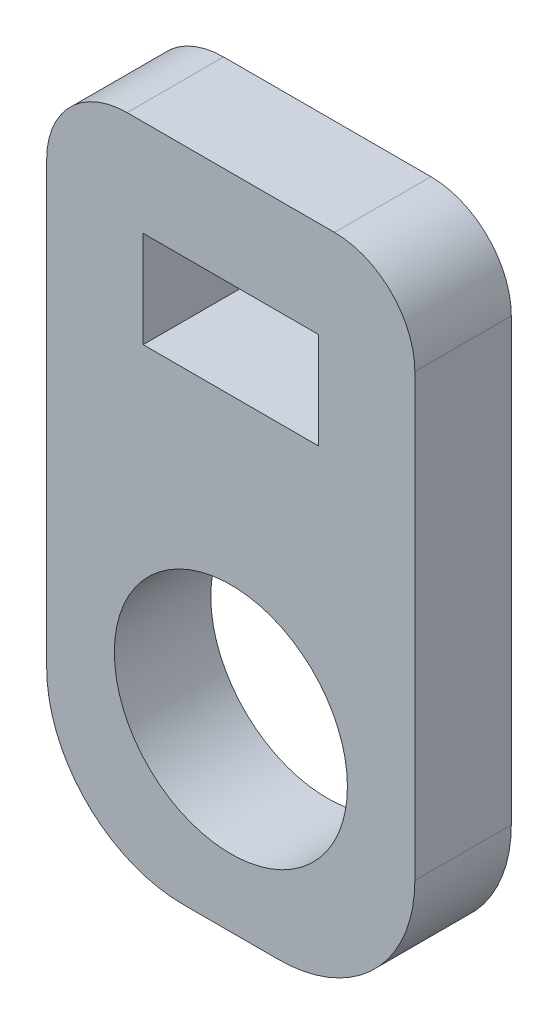
ISO-10303-21;
HEADER;
FILE_DESCRIPTION(('STEP AP214'),'2;1');
FILE_NAME('part.step','',(''),(''),'','','');
FILE_SCHEMA(('AUTOMOTIVE_DESIGN { 1 0 10303 214 1 1 1 1 }'));
ENDSEC;
DATA;
#1=APPLICATION_CONTEXT('core data for automotive mechanical design processes');
#2=APPLICATION_PROTOCOL_DEFINITION('international standard','automotive_design',2000,#1);
#3=PRODUCT_CONTEXT('',#1,'mechanical');
#4=PRODUCT('Part','Part','',(#3));
#5=PRODUCT_RELATED_PRODUCT_CATEGORY('part','',(#4));
#6=PRODUCT_DEFINITION_FORMATION('','',#4);
#7=PRODUCT_DEFINITION_CONTEXT('part definition',#1,'design');
#8=PRODUCT_DEFINITION('design','',#6,#7);
#9=PRODUCT_DEFINITION_SHAPE('','',#8);
#10=(LENGTH_UNIT() NAMED_UNIT(*) SI_UNIT(.MILLI.,.METRE.));
#11=(NAMED_UNIT(*) PLANE_ANGLE_UNIT() SI_UNIT($,.RADIAN.));
#12=(NAMED_UNIT(*) SI_UNIT($,.STERADIAN.) SOLID_ANGLE_UNIT());
#13=UNCERTAINTY_MEASURE_WITH_UNIT(LENGTH_MEASURE(1.E-05),#10,'distance_accuracy_value','');
#14=(GEOMETRIC_REPRESENTATION_CONTEXT(3) GLOBAL_UNCERTAINTY_ASSIGNED_CONTEXT((#13)) GLOBAL_UNIT_ASSIGNED_CONTEXT((#10,
#11,#12)) REPRESENTATION_CONTEXT('',''));
#15=CARTESIAN_POINT('',(0.,0.,0.));
#16=DIRECTION('',(0.,0.,1.));
#17=DIRECTION('',(1.,0.,0.));
#18=AXIS2_PLACEMENT_3D('',#15,#16,#17);
#19=CARTESIAN_POINT('',(0.,0.,15.24));
#20=DIRECTION('',(1.,0.,0.));
#21=DIRECTION('',(0.,0.,-1.));
#22=AXIS2_PLACEMENT_3D('',#19,#20,#21);
#23=PLANE('',#22);
#24=DIRECTION('',(0.,-1.,0.));
#25=VECTOR('',#24,1.);
#26=CARTESIAN_POINT('',(0.,0.,15.24));
#27=LINE('',#26,#25);
#28=CARTESIAN_POINT('',(0.,91.219999932,15.24));
#29=VERTEX_POINT('',#28);
#30=CARTESIAN_POINT('',(0.,21.59,15.24));
#31=VERTEX_POINT('',#30);
#32=EDGE_CURVE('E171',#29,#31,#27,.T.);
#33=ORIENTED_EDGE('',*,*,#32,.F.);
#34=DIRECTION('',(0.,0.,-1.));
#35=VECTOR('',#34,1.);
#36=CARTESIAN_POINT('',(0.,91.219999932,15.24));
#37=LINE('',#36,#35);
#38=CARTESIAN_POINT('',(0.,91.219999932,0.));
#39=VERTEX_POINT('',#38);
#40=EDGE_CURVE('E208',#29,#39,#37,.T.);
#41=ORIENTED_EDGE('',*,*,#40,.T.);
#42=DIRECTION('',(0.,-1.,0.));
#43=VECTOR('',#42,1.);
#44=CARTESIAN_POINT('',(0.,0.,0.));
#45=LINE('',#44,#43);
#46=CARTESIAN_POINT('',(0.,21.59,0.));
#47=VERTEX_POINT('',#46);
#48=EDGE_CURVE('E167',#39,#47,#45,.T.);
#49=ORIENTED_EDGE('',*,*,#48,.T.);
#50=DIRECTION('',(0.,0.,-1.));
#51=VECTOR('',#50,1.);
#52=CARTESIAN_POINT('',(0.,21.59,15.24));
#53=LINE('',#52,#51);
#54=EDGE_CURVE('E205',#47,#31,#53,.F.);
#55=ORIENTED_EDGE('',*,*,#54,.T.);
#56=EDGE_LOOP('',(#33,#41,#49,#55));
#57=FACE_BOUND('',#56,.T.);
#58=ADVANCED_FACE('F33',(#57),#23,.F.);
#59=CARTESIAN_POINT('',(0.,0.,15.24));
#60=DIRECTION('',(0.,1.,0.));
#61=DIRECTION('',(0.,0.,1.));
#62=AXIS2_PLACEMENT_3D('',#59,#60,#61);
#63=PLANE('',#62);
#64=DIRECTION('',(1.,0.,0.));
#65=VECTOR('',#64,1.);
#66=CARTESIAN_POINT('',(0.,0.,0.));
#67=LINE('',#66,#65);
#68=CARTESIAN_POINT('',(21.59,0.,0.));
#69=VERTEX_POINT('',#68);
#70=CARTESIAN_POINT('',(36.576,0.,0.));
#71=VERTEX_POINT('',#70);
#72=EDGE_CURVE('E183',#69,#71,#67,.T.);
#73=ORIENTED_EDGE('',*,*,#72,.T.);
#74=DIRECTION('',(0.,0.,-1.));
#75=VECTOR('',#74,1.);
#76=CARTESIAN_POINT('',(36.576,0.,15.24));
#77=LINE('',#76,#75);
#78=CARTESIAN_POINT('',(36.576,0.,15.24));
#79=VERTEX_POINT('',#78);
#80=EDGE_CURVE('E199',#71,#79,#77,.F.);
#81=ORIENTED_EDGE('',*,*,#80,.T.);
#82=DIRECTION('',(1.,0.,0.));
#83=VECTOR('',#82,1.);
#84=CARTESIAN_POINT('',(0.,0.,15.24));
#85=LINE('',#84,#83);
#86=CARTESIAN_POINT('',(21.59,0.,15.24));
#87=VERTEX_POINT('',#86);
#88=EDGE_CURVE('E173',#87,#79,#85,.T.);
#89=ORIENTED_EDGE('',*,*,#88,.F.);
#90=DIRECTION('',(0.,0.,-1.));
#91=VECTOR('',#90,1.);
#92=CARTESIAN_POINT('',(21.59,0.,15.24));
#93=LINE('',#92,#91);
#94=EDGE_CURVE('E196',#87,#69,#93,.T.);
#95=ORIENTED_EDGE('',*,*,#94,.T.);
#96=EDGE_LOOP('',(#73,#81,#89,#95));
#97=FACE_BOUND('',#96,.T.);
#98=ADVANCED_FACE('F245',(#97),#63,.F.);
#99=CARTESIAN_POINT('',(58.166,0.,15.24));
#100=DIRECTION('',(-1.,0.,0.));
#101=DIRECTION('',(0.,0.,1.));
#102=AXIS2_PLACEMENT_3D('',#99,#100,#101);
#103=PLANE('',#102);
#104=DIRECTION('',(0.,1.,0.));
#105=VECTOR('',#104,1.);
#106=CARTESIAN_POINT('',(58.166,0.,0.));
#107=LINE('',#106,#105);
#108=CARTESIAN_POINT('',(58.166,21.59,0.));
#109=VERTEX_POINT('',#108);
#110=CARTESIAN_POINT('',(58.166,91.219999932,0.));
#111=VERTEX_POINT('',#110);
#112=EDGE_CURVE('E186',#109,#111,#107,.T.);
#113=ORIENTED_EDGE('',*,*,#112,.T.);
#114=DIRECTION('',(0.,0.,-1.));
#115=VECTOR('',#114,1.);
#116=CARTESIAN_POINT('',(58.166,91.219999932,15.24));
#117=LINE('',#116,#115);
#118=CARTESIAN_POINT('',(58.166,91.219999932,15.24));
#119=VERTEX_POINT('',#118);
#120=EDGE_CURVE('E11',#111,#119,#117,.F.);
#121=ORIENTED_EDGE('',*,*,#120,.T.);
#122=DIRECTION('',(0.,1.,0.));
#123=VECTOR('',#122,1.);
#124=CARTESIAN_POINT('',(58.166,0.,15.24));
#125=LINE('',#124,#123);
#126=CARTESIAN_POINT('',(58.166,21.59,15.24));
#127=VERTEX_POINT('',#126);
#128=EDGE_CURVE('E177',#127,#119,#125,.T.);
#129=ORIENTED_EDGE('',*,*,#128,.F.);
#130=DIRECTION('',(0.,0.,-1.));
#131=VECTOR('',#130,1.);
#132=CARTESIAN_POINT('',(58.166,21.59,15.24));
#133=LINE('',#132,#131);
#134=EDGE_CURVE('E181',#127,#109,#133,.T.);
#135=ORIENTED_EDGE('',*,*,#134,.T.);
#136=EDGE_LOOP('',(#113,#121,#129,#135));
#137=FACE_BOUND('',#136,.T.);
#138=ADVANCED_FACE('F237',(#137),#103,.F.);
#139=CARTESIAN_POINT('',(0.,103.919999932,15.24));
#140=DIRECTION('',(0.,-1.,0.));
#141=DIRECTION('',(0.,0.,-1.));
#142=AXIS2_PLACEMENT_3D('',#139,#140,#141);
#143=PLANE('',#142);
#144=DIRECTION('',(-1.,0.,0.));
#145=VECTOR('',#144,1.);
#146=CARTESIAN_POINT('',(0.,103.919999932,0.));
#147=LINE('',#146,#145);
#148=CARTESIAN_POINT('',(45.466,103.919999932,0.));
#149=VERTEX_POINT('',#148);
#150=CARTESIAN_POINT('',(12.7,103.919999932,0.));
#151=VERTEX_POINT('',#150);
#152=EDGE_CURVE('E174',#149,#151,#147,.T.);
#153=ORIENTED_EDGE('',*,*,#152,.T.);
#154=DIRECTION('',(0.,0.,-1.));
#155=VECTOR('',#154,1.);
#156=CARTESIAN_POINT('',(12.7,103.919999932,15.24));
#157=LINE('',#156,#155);
#158=CARTESIAN_POINT('',(12.7,103.919999932,15.24));
#159=VERTEX_POINT('',#158);
#160=EDGE_CURVE('E54',#151,#159,#157,.F.);
#161=ORIENTED_EDGE('',*,*,#160,.T.);
#162=DIRECTION('',(-1.,0.,0.));
#163=VECTOR('',#162,1.);
#164=CARTESIAN_POINT('',(0.,103.919999932,15.24));
#165=LINE('',#164,#163);
#166=CARTESIAN_POINT('',(45.466,103.919999932,15.24));
#167=VERTEX_POINT('',#166);
#168=EDGE_CURVE('E179',#167,#159,#165,.T.);
#169=ORIENTED_EDGE('',*,*,#168,.F.);
#170=DIRECTION('',(0.,0.,-1.));
#171=VECTOR('',#170,1.);
#172=CARTESIAN_POINT('',(45.466,103.919999932,15.24));
#173=LINE('',#172,#171);
#174=EDGE_CURVE('E215',#167,#149,#173,.T.);
#175=ORIENTED_EDGE('',*,*,#174,.T.);
#176=EDGE_LOOP('',(#153,#161,#169,#175));
#177=FACE_BOUND('',#176,.T.);
#178=ADVANCED_FACE('F232',(#177),#143,.F.);
#179=CARTESIAN_POINT('',(0.,0.,15.24));
#180=DIRECTION('',(0.,0.,-1.));
#181=DIRECTION('',(-1.,0.,0.));
#182=AXIS2_PLACEMENT_3D('',#179,#180,#181);
#183=PLANE('',#182);
#184=CARTESIAN_POINT('',(29.099999966,29.1,15.24));
#185=DIRECTION('',(0.,0.,-1.));
#186=DIRECTION('',(-1.,0.,0.));
#187=AXIS2_PLACEMENT_3D('',#184,#185,#186);
#188=CIRCLE('',#187,18.415);
#189=CARTESIAN_POINT('',(47.514999966,29.1,15.24));
#190=VERTEX_POINT('',#189);
#191=EDGE_CURVE('E155',#190,#190,#188,.T.);
#192=ORIENTED_EDGE('',*,*,#191,.T.);
#193=EDGE_LOOP('',(#192));
#194=FACE_BOUND('',#193,.T.);
#195=DIRECTION('',(1.,0.,0.));
#196=VECTOR('',#195,1.);
#197=CARTESIAN_POINT('',(15.24,73.439999932,15.24));
#198=LINE('',#197,#196);
#199=CARTESIAN_POINT('',(15.24,73.439999932,15.24));
#200=VERTEX_POINT('',#199);
#201=CARTESIAN_POINT('',(42.926,73.439999932,15.24));
#202=VERTEX_POINT('',#201);
#203=EDGE_CURVE('E161',#200,#202,#198,.T.);
#204=ORIENTED_EDGE('',*,*,#203,.F.);
#205=DIRECTION('',(0.,-1.,0.));
#206=VECTOR('',#205,1.);
#207=CARTESIAN_POINT('',(15.24,88.679999932,15.24));
#208=LINE('',#207,#206);
#209=CARTESIAN_POINT('',(15.24,88.679999932,15.24));
#210=VERTEX_POINT('',#209);
#211=EDGE_CURVE('E131',#210,#200,#208,.T.);
#212=ORIENTED_EDGE('',*,*,#211,.F.);
#213=DIRECTION('',(-1.,0.,0.));
#214=VECTOR('',#213,1.);
#215=CARTESIAN_POINT('',(15.24,88.679999932,15.24));
#216=LINE('',#215,#214);
#217=CARTESIAN_POINT('',(42.926,88.679999932,15.24));
#218=VERTEX_POINT('',#217);
#219=EDGE_CURVE('E149',#218,#210,#216,.T.);
#220=ORIENTED_EDGE('',*,*,#219,.F.);
#221=DIRECTION('',(0.,1.,0.));
#222=VECTOR('',#221,1.);
#223=CARTESIAN_POINT('',(42.926,88.679999932,15.24));
#224=LINE('',#223,#222);
#225=EDGE_CURVE('E152',#202,#218,#224,.T.);
#226=ORIENTED_EDGE('',*,*,#225,.F.);
#227=EDGE_LOOP('',(#204,#212,#220,#226));
#228=FACE_BOUND('',#227,.T.);
#229=ORIENTED_EDGE('',*,*,#168,.T.);
#230=CARTESIAN_POINT('',(12.7,91.219999932,15.24));
#231=DIRECTION('',(0.,0.,-1.));
#232=DIRECTION('',(-1.,0.,0.));
#233=AXIS2_PLACEMENT_3D('',#230,#231,#232);
#234=CIRCLE('',#233,12.7);
#235=EDGE_CURVE('E41',#159,#29,#234,.F.);
#236=ORIENTED_EDGE('',*,*,#235,.T.);
#237=ORIENTED_EDGE('',*,*,#32,.T.);
#238=CARTESIAN_POINT('',(21.59,21.59,15.24));
#239=DIRECTION('',(0.,0.,-1.));
#240=DIRECTION('',(-1.,0.,0.));
#241=AXIS2_PLACEMENT_3D('',#238,#239,#240);
#242=CIRCLE('',#241,21.59);
#243=EDGE_CURVE('E201',#31,#87,#242,.F.);
#244=ORIENTED_EDGE('',*,*,#243,.T.);
#245=ORIENTED_EDGE('',*,*,#88,.T.);
#246=CARTESIAN_POINT('',(36.576,21.59,15.24));
#247=DIRECTION('',(0.,0.,-1.));
#248=DIRECTION('',(-1.,0.,0.));
#249=AXIS2_PLACEMENT_3D('',#246,#247,#248);
#250=CIRCLE('',#249,21.59);
#251=EDGE_CURVE('E203',#79,#127,#250,.F.);
#252=ORIENTED_EDGE('',*,*,#251,.T.);
#253=ORIENTED_EDGE('',*,*,#128,.T.);
#254=CARTESIAN_POINT('',(45.466,91.219999932,15.24));
#255=DIRECTION('',(0.,0.,-1.));
#256=DIRECTION('',(-1.,0.,0.));
#257=AXIS2_PLACEMENT_3D('',#254,#255,#256);
#258=CIRCLE('',#257,12.7);
#259=EDGE_CURVE('E219',#119,#167,#258,.F.);
#260=ORIENTED_EDGE('',*,*,#259,.T.);
#261=EDGE_LOOP('',(#229,#236,#237,#244,#245,#252,#253,#260));
#262=FACE_BOUND('',#261,.T.);
#263=ADVANCED_FACE('F223',(#194,#228,#262),#183,.F.);
#264=CARTESIAN_POINT('',(0.,0.,0.));
#265=DIRECTION('',(0.,0.,-1.));
#266=DIRECTION('',(-1.,0.,0.));
#267=AXIS2_PLACEMENT_3D('',#264,#265,#266);
#268=PLANE('',#267);
#269=CARTESIAN_POINT('',(29.099999966,29.1,0.));
#270=DIRECTION('',(0.,0.,1.));
#271=DIRECTION('',(1.,0.,0.));
#272=AXIS2_PLACEMENT_3D('',#269,#270,#271);
#273=CIRCLE('',#272,18.415);
#274=CARTESIAN_POINT('',(47.514999966,29.1,0.));
#275=VERTEX_POINT('',#274);
#276=EDGE_CURVE('E294',#275,#275,#273,.T.);
#277=ORIENTED_EDGE('',*,*,#276,.T.);
#278=EDGE_LOOP('',(#277));
#279=FACE_BOUND('',#278,.T.);
#280=DIRECTION('',(0.,-1.,0.));
#281=VECTOR('',#280,1.);
#282=CARTESIAN_POINT('',(15.24,88.679999932,0.));
#283=LINE('',#282,#281);
#284=CARTESIAN_POINT('',(15.24,88.679999932,0.));
#285=VERTEX_POINT('',#284);
#286=CARTESIAN_POINT('',(15.24,73.439999932,0.));
#287=VERTEX_POINT('',#286);
#288=EDGE_CURVE('E128',#285,#287,#283,.T.);
#289=ORIENTED_EDGE('',*,*,#288,.T.);
#290=DIRECTION('',(1.,0.,0.));
#291=VECTOR('',#290,1.);
#292=CARTESIAN_POINT('',(15.24,73.439999932,0.));
#293=LINE('',#292,#291);
#294=CARTESIAN_POINT('',(42.926,73.439999932,0.));
#295=VERTEX_POINT('',#294);
#296=EDGE_CURVE('E140',#287,#295,#293,.T.);
#297=ORIENTED_EDGE('',*,*,#296,.T.);
#298=DIRECTION('',(0.,1.,0.));
#299=VECTOR('',#298,1.);
#300=CARTESIAN_POINT('',(42.926,88.679999932,0.));
#301=LINE('',#300,#299);
#302=CARTESIAN_POINT('',(42.926,88.679999932,0.));
#303=VERTEX_POINT('',#302);
#304=EDGE_CURVE('E144',#295,#303,#301,.T.);
#305=ORIENTED_EDGE('',*,*,#304,.T.);
#306=DIRECTION('',(-1.,0.,0.));
#307=VECTOR('',#306,1.);
#308=CARTESIAN_POINT('',(15.24,88.679999932,0.));
#309=LINE('',#308,#307);
#310=EDGE_CURVE('E136',#303,#285,#309,.T.);
#311=ORIENTED_EDGE('',*,*,#310,.T.);
#312=EDGE_LOOP('',(#289,#297,#305,#311));
#313=FACE_BOUND('',#312,.T.);
#314=ORIENTED_EDGE('',*,*,#48,.F.);
#315=CARTESIAN_POINT('',(12.7,91.219999932,0.));
#316=DIRECTION('',(0.,0.,-1.));
#317=DIRECTION('',(-1.,0.,0.));
#318=AXIS2_PLACEMENT_3D('',#315,#316,#317);
#319=CIRCLE('',#318,12.7);
#320=EDGE_CURVE('E213',#39,#151,#319,.T.);
#321=ORIENTED_EDGE('',*,*,#320,.T.);
#322=ORIENTED_EDGE('',*,*,#152,.F.);
#323=CARTESIAN_POINT('',(45.466,91.219999932,0.));
#324=DIRECTION('',(0.,0.,-1.));
#325=DIRECTION('',(-1.,0.,0.));
#326=AXIS2_PLACEMENT_3D('',#323,#324,#325);
#327=CIRCLE('',#326,12.7);
#328=EDGE_CURVE('E211',#149,#111,#327,.T.);
#329=ORIENTED_EDGE('',*,*,#328,.T.);
#330=ORIENTED_EDGE('',*,*,#112,.F.);
#331=CARTESIAN_POINT('',(36.576,21.59,0.));
#332=DIRECTION('',(0.,0.,-1.));
#333=DIRECTION('',(-1.,0.,0.));
#334=AXIS2_PLACEMENT_3D('',#331,#332,#333);
#335=CIRCLE('',#334,21.59);
#336=EDGE_CURVE('E194',#109,#71,#335,.T.);
#337=ORIENTED_EDGE('',*,*,#336,.T.);
#338=ORIENTED_EDGE('',*,*,#72,.F.);
#339=CARTESIAN_POINT('',(21.59,21.59,0.));
#340=DIRECTION('',(0.,0.,-1.));
#341=DIRECTION('',(-1.,0.,0.));
#342=AXIS2_PLACEMENT_3D('',#339,#340,#341);
#343=CIRCLE('',#342,21.59);
#344=EDGE_CURVE('E191',#69,#47,#343,.T.);
#345=ORIENTED_EDGE('',*,*,#344,.T.);
#346=EDGE_LOOP('',(#314,#321,#322,#329,#330,#337,#338,#345));
#347=FACE_BOUND('',#346,.T.);
#348=ADVANCED_FACE('F146',(#279,#313,#347),#268,.T.);
#349=CARTESIAN_POINT('',(15.24,88.679999932,0.));
#350=DIRECTION('',(-1.,0.,0.));
#351=DIRECTION('',(0.,0.,1.));
#352=AXIS2_PLACEMENT_3D('',#349,#350,#351);
#353=PLANE('',#352);
#354=ORIENTED_EDGE('',*,*,#211,.T.);
#355=DIRECTION('',(0.,0.,1.));
#356=VECTOR('',#355,1.);
#357=CARTESIAN_POINT('',(15.24,73.439999932,0.));
#358=LINE('',#357,#356);
#359=EDGE_CURVE('E124',#287,#200,#358,.T.);
#360=ORIENTED_EDGE('',*,*,#359,.F.);
#361=ORIENTED_EDGE('',*,*,#288,.F.);
#362=DIRECTION('',(0.,0.,1.));
#363=VECTOR('',#362,1.);
#364=CARTESIAN_POINT('',(15.24,88.679999932,0.));
#365=LINE('',#364,#363);
#366=EDGE_CURVE('E165',#285,#210,#365,.T.);
#367=ORIENTED_EDGE('',*,*,#366,.T.);
#368=EDGE_LOOP('',(#354,#360,#361,#367));
#369=FACE_BOUND('',#368,.T.);
#370=ADVANCED_FACE('F126',(#369),#353,.F.);
#371=CARTESIAN_POINT('',(15.24,88.679999932,0.));
#372=DIRECTION('',(0.,1.,0.));
#373=DIRECTION('',(-1.,0.,0.));
#374=AXIS2_PLACEMENT_3D('',#371,#372,#373);
#375=PLANE('',#374);
#376=ORIENTED_EDGE('',*,*,#219,.T.);
#377=ORIENTED_EDGE('',*,*,#366,.F.);
#378=ORIENTED_EDGE('',*,*,#310,.F.);
#379=DIRECTION('',(0.,0.,1.));
#380=VECTOR('',#379,1.);
#381=CARTESIAN_POINT('',(42.926,88.679999932,0.));
#382=LINE('',#381,#380);
#383=EDGE_CURVE('E168',#303,#218,#382,.T.);
#384=ORIENTED_EDGE('',*,*,#383,.T.);
#385=EDGE_LOOP('',(#376,#377,#378,#384));
#386=FACE_BOUND('',#385,.T.);
#387=ADVANCED_FACE('F277',(#386),#375,.F.);
#388=CARTESIAN_POINT('',(42.926,88.679999932,0.));
#389=DIRECTION('',(1.,0.,0.));
#390=DIRECTION('',(0.,0.,-1.));
#391=AXIS2_PLACEMENT_3D('',#388,#389,#390);
#392=PLANE('',#391);
#393=ORIENTED_EDGE('',*,*,#225,.T.);
#394=ORIENTED_EDGE('',*,*,#383,.F.);
#395=ORIENTED_EDGE('',*,*,#304,.F.);
#396=DIRECTION('',(0.,0.,1.));
#397=VECTOR('',#396,1.);
#398=CARTESIAN_POINT('',(42.926,73.439999932,0.));
#399=LINE('',#398,#397);
#400=EDGE_CURVE('E135',#295,#202,#399,.T.);
#401=ORIENTED_EDGE('',*,*,#400,.T.);
#402=EDGE_LOOP('',(#393,#394,#395,#401));
#403=FACE_BOUND('',#402,.T.);
#404=ADVANCED_FACE('F280',(#403),#392,.F.);
#405=CARTESIAN_POINT('',(15.24,73.439999932,0.));
#406=DIRECTION('',(0.,-1.,0.));
#407=DIRECTION('',(1.,0.,0.));
#408=AXIS2_PLACEMENT_3D('',#405,#406,#407);
#409=PLANE('',#408);
#410=ORIENTED_EDGE('',*,*,#203,.T.);
#411=ORIENTED_EDGE('',*,*,#400,.F.);
#412=ORIENTED_EDGE('',*,*,#296,.F.);
#413=ORIENTED_EDGE('',*,*,#359,.T.);
#414=EDGE_LOOP('',(#410,#411,#412,#413));
#415=FACE_BOUND('',#414,.T.);
#416=ADVANCED_FACE('F141',(#415),#409,.F.);
#417=CARTESIAN_POINT('',(29.099999966,29.1,0.));
#418=DIRECTION('',(0.,0.,1.));
#419=DIRECTION('',(1.,0.,0.));
#420=AXIS2_PLACEMENT_3D('',#417,#418,#419);
#421=CYLINDRICAL_SURFACE('',#420,18.415);
#422=CARTESIAN_POINT('',(47.514999966,29.1,0.));
#423=CARTESIAN_POINT('',(47.514999966,29.1,0.15875));
#424=CARTESIAN_POINT('',(47.514999966,29.1,0.3175));
#425=CARTESIAN_POINT('',(47.514999966,29.1,0.635));
#426=CARTESIAN_POINT('',(47.514999966,29.1,0.79375));
#427=CARTESIAN_POINT('',(47.514999966,29.1,1.11125));
#428=CARTESIAN_POINT('',(47.514999966,29.1,1.27));
#429=CARTESIAN_POINT('',(47.514999966,29.1,1.5875));
#430=CARTESIAN_POINT('',(47.514999966,29.1,1.74625));
#431=CARTESIAN_POINT('',(47.514999966,29.1,2.06375));
#432=CARTESIAN_POINT('',(47.514999966,29.1,2.2225));
#433=CARTESIAN_POINT('',(47.514999966,29.1,2.54));
#434=CARTESIAN_POINT('',(47.514999966,29.1,2.69875));
#435=CARTESIAN_POINT('',(47.514999966,29.1,3.01625));
#436=CARTESIAN_POINT('',(47.514999966,29.1,3.175));
#437=CARTESIAN_POINT('',(47.514999966,29.1,3.4925));
#438=CARTESIAN_POINT('',(47.514999966,29.1,3.65125));
#439=CARTESIAN_POINT('',(47.514999966,29.1,3.96875));
#440=CARTESIAN_POINT('',(47.514999966,29.1,4.1275));
#441=CARTESIAN_POINT('',(47.514999966,29.1,4.445));
#442=CARTESIAN_POINT('',(47.514999966,29.1,4.60375));
#443=CARTESIAN_POINT('',(47.514999966,29.1,4.92125));
#444=CARTESIAN_POINT('',(47.514999966,29.1,5.08));
#445=CARTESIAN_POINT('',(47.514999966,29.1,5.3975));
#446=CARTESIAN_POINT('',(47.514999966,29.1,5.55625));
#447=CARTESIAN_POINT('',(47.514999966,29.1,5.87375));
#448=CARTESIAN_POINT('',(47.514999966,29.1,6.0325));
#449=CARTESIAN_POINT('',(47.514999966,29.1,6.35));
#450=CARTESIAN_POINT('',(47.514999966,29.1,6.50875));
#451=CARTESIAN_POINT('',(47.514999966,29.1,6.82625));
#452=CARTESIAN_POINT('',(47.514999966,29.1,6.985));
#453=CARTESIAN_POINT('',(47.514999966,29.1,7.3025));
#454=CARTESIAN_POINT('',(47.514999966,29.1,7.46125));
#455=CARTESIAN_POINT('',(47.514999966,29.1,7.77875));
#456=CARTESIAN_POINT('',(47.514999966,29.1,7.9375));
#457=CARTESIAN_POINT('',(47.514999966,29.1,8.255));
#458=CARTESIAN_POINT('',(47.514999966,29.1,8.41375));
#459=CARTESIAN_POINT('',(47.514999966,29.1,8.73125));
#460=CARTESIAN_POINT('',(47.514999966,29.1,8.89));
#461=CARTESIAN_POINT('',(47.514999966,29.1,9.2075));
#462=CARTESIAN_POINT('',(47.514999966,29.1,9.36625));
#463=CARTESIAN_POINT('',(47.514999966,29.1,9.68375));
#464=CARTESIAN_POINT('',(47.514999966,29.1,9.8425));
#465=CARTESIAN_POINT('',(47.514999966,29.1,10.16));
#466=CARTESIAN_POINT('',(47.514999966,29.1,10.31875));
#467=CARTESIAN_POINT('',(47.514999966,29.1,10.63625));
#468=CARTESIAN_POINT('',(47.514999966,29.1,10.795));
#469=CARTESIAN_POINT('',(47.514999966,29.1,11.1125));
#470=CARTESIAN_POINT('',(47.514999966,29.1,11.27125));
#471=CARTESIAN_POINT('',(47.514999966,29.1,11.58875));
#472=CARTESIAN_POINT('',(47.514999966,29.1,11.7475));
#473=CARTESIAN_POINT('',(47.514999966,29.1,12.065));
#474=CARTESIAN_POINT('',(47.514999966,29.1,12.22375));
#475=CARTESIAN_POINT('',(47.514999966,29.1,12.54125));
#476=CARTESIAN_POINT('',(47.514999966,29.1,12.7));
#477=CARTESIAN_POINT('',(47.514999966,29.1,13.0175));
#478=CARTESIAN_POINT('',(47.514999966,29.1,13.17625));
#479=CARTESIAN_POINT('',(47.514999966,29.1,13.49375));
#480=CARTESIAN_POINT('',(47.514999966,29.1,13.6525));
#481=CARTESIAN_POINT('',(47.514999966,29.1,13.97));
#482=CARTESIAN_POINT('',(47.514999966,29.1,14.12875));
#483=CARTESIAN_POINT('',(47.514999966,29.1,14.44625));
#484=CARTESIAN_POINT('',(47.514999966,29.1,14.605));
#485=CARTESIAN_POINT('',(47.514999966,29.1,14.9225));
#486=CARTESIAN_POINT('',(47.514999966,29.1,15.08125));
#487=CARTESIAN_POINT('',(47.514999966,29.1,15.24));
#488=B_SPLINE_CURVE_WITH_KNOTS('',3,(#422,#423,#424,#425,#426,#427,#428,#429,#430,#431,#432,
#433,#434,#435,#436,#437,#438,#439,#440,#441,#442,#443,#444,#445,#446,#447,#448,#449,#450,#451,
#452,#453,#454,#455,#456,#457,#458,#459,#460,#461,#462,#463,#464,#465,#466,#467,#468,#469,#470,
#471,#472,#473,#474,#475,#476,#477,#478,#479,#480,#481,#482,#483,#484,#485,#486,#487),
.UNSPECIFIED.,.F.,.F.,(4,2,2,2,2,2,2,2,2,2,2,2,2,2,2,2,2,2,2,2,2,2,2,2,2,2,2,2,2,2,2,2,4),(0.,
0.47625,0.9525,1.42875,1.905,2.38125,2.8575,3.33375,3.81,4.28625,4.7625,5.23875,5.715,6.19125,
6.6675,7.14375,7.62,8.09625,8.5725,9.04875,9.525,10.00125,10.4775,10.95375,11.43,11.90625,
12.3825,12.85875,13.335,13.81125,14.2875,14.76375,15.24),.UNSPECIFIED.);
#489=EDGE_CURVE('BSEAM256',#275,#190,#488,.T.);
#490=ORIENTED_EDGE('',*,*,#276,.F.);
#491=ORIENTED_EDGE('',*,*,#191,.F.);
#492=ORIENTED_EDGE('',*,*,#489,.T.);
#493=ORIENTED_EDGE('',*,*,#489,.F.);
#494=EDGE_LOOP('',(#490,#492,#491,#493));
#495=FACE_BOUND('',#494,.T.);
#496=ADVANCED_FACE('F256',(#495),#421,.F.);
#497=CARTESIAN_POINT('',(36.576,21.59,15.24));
#498=DIRECTION('',(0.,0.,-1.));
#499=DIRECTION('',(-1.,0.,0.));
#500=AXIS2_PLACEMENT_3D('',#497,#498,#499);
#501=CYLINDRICAL_SURFACE('',#500,21.59);
#502=ORIENTED_EDGE('',*,*,#251,.F.);
#503=ORIENTED_EDGE('',*,*,#80,.F.);
#504=ORIENTED_EDGE('',*,*,#336,.F.);
#505=ORIENTED_EDGE('',*,*,#134,.F.);
#506=EDGE_LOOP('',(#502,#503,#504,#505));
#507=FACE_BOUND('',#506,.T.);
#508=ADVANCED_FACE('F241',(#507),#501,.T.);
#509=CARTESIAN_POINT('',(21.59,21.59,15.24));
#510=DIRECTION('',(0.,0.,-1.));
#511=DIRECTION('',(-1.,0.,0.));
#512=AXIS2_PLACEMENT_3D('',#509,#510,#511);
#513=CYLINDRICAL_SURFACE('',#512,21.59);
#514=ORIENTED_EDGE('',*,*,#243,.F.);
#515=ORIENTED_EDGE('',*,*,#54,.F.);
#516=ORIENTED_EDGE('',*,*,#344,.F.);
#517=ORIENTED_EDGE('',*,*,#94,.F.);
#518=EDGE_LOOP('',(#514,#515,#516,#517));
#519=FACE_BOUND('',#518,.T.);
#520=ADVANCED_FACE('F249',(#519),#513,.T.);
#521=CARTESIAN_POINT('',(12.7,91.219999932,15.24));
#522=DIRECTION('',(0.,0.,-1.));
#523=DIRECTION('',(-1.,0.,0.));
#524=AXIS2_PLACEMENT_3D('',#521,#522,#523);
#525=CYLINDRICAL_SURFACE('',#524,12.7);
#526=ORIENTED_EDGE('',*,*,#235,.F.);
#527=ORIENTED_EDGE('',*,*,#160,.F.);
#528=ORIENTED_EDGE('',*,*,#320,.F.);
#529=ORIENTED_EDGE('',*,*,#40,.F.);
#530=EDGE_LOOP('',(#526,#527,#528,#529));
#531=FACE_BOUND('',#530,.T.);
#532=ADVANCED_FACE('F230',(#531),#525,.T.);
#533=CARTESIAN_POINT('',(45.466,91.219999932,15.24));
#534=DIRECTION('',(0.,0.,-1.));
#535=DIRECTION('',(-1.,0.,0.));
#536=AXIS2_PLACEMENT_3D('',#533,#534,#535);
#537=CYLINDRICAL_SURFACE('',#536,12.7);
#538=ORIENTED_EDGE('',*,*,#259,.F.);
#539=ORIENTED_EDGE('',*,*,#120,.F.);
#540=ORIENTED_EDGE('',*,*,#328,.F.);
#541=ORIENTED_EDGE('',*,*,#174,.F.);
#542=EDGE_LOOP('',(#538,#539,#540,#541));
#543=FACE_BOUND('',#542,.T.);
#544=ADVANCED_FACE('F35',(#543),#537,.T.);
#545=CLOSED_SHELL('',(#58,#98,#138,#178,#263,#348,#370,#387,#404,#416,#496,#508,#520,#532,#544));
#546=MANIFOLD_SOLID_BREP('B2',#545);
#547=ADVANCED_BREP_SHAPE_REPRESENTATION('',(#18,#546),#14);
#548=SHAPE_DEFINITION_REPRESENTATION(#9,#547);
ENDSEC;
END-ISO-10303-21;
